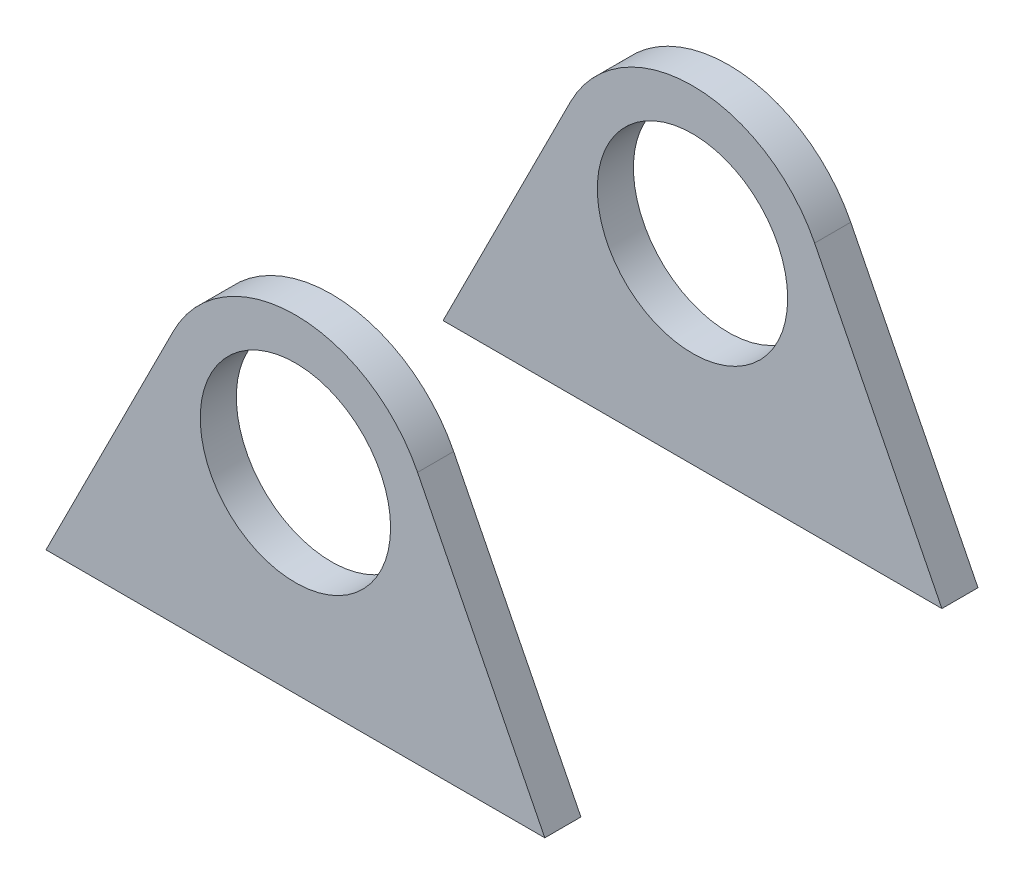
ISO-10303-21;
HEADER;
FILE_DESCRIPTION(('STEP AP214'),'2;1');
FILE_NAME('part.step','',(''),(''),'','','');
FILE_SCHEMA(('AUTOMOTIVE_DESIGN { 1 0 10303 214 1 1 1 1 }'));
ENDSEC;
DATA;
#1=APPLICATION_CONTEXT('core data for automotive mechanical design processes');
#2=APPLICATION_PROTOCOL_DEFINITION('international standard','automotive_design',2000,#1);
#3=PRODUCT_CONTEXT('',#1,'mechanical');
#4=PRODUCT('Part','Part','',(#3));
#5=PRODUCT_RELATED_PRODUCT_CATEGORY('part','',(#4));
#6=PRODUCT_DEFINITION_FORMATION('','',#4);
#7=PRODUCT_DEFINITION_CONTEXT('part definition',#1,'design');
#8=PRODUCT_DEFINITION('design','',#6,#7);
#9=PRODUCT_DEFINITION_SHAPE('','',#8);
#10=(LENGTH_UNIT() NAMED_UNIT(*) SI_UNIT(.MILLI.,.METRE.));
#11=(NAMED_UNIT(*) PLANE_ANGLE_UNIT() SI_UNIT($,.RADIAN.));
#12=(NAMED_UNIT(*) SI_UNIT($,.STERADIAN.) SOLID_ANGLE_UNIT());
#13=UNCERTAINTY_MEASURE_WITH_UNIT(LENGTH_MEASURE(1.E-05),#10,'distance_accuracy_value','');
#14=(GEOMETRIC_REPRESENTATION_CONTEXT(3) GLOBAL_UNCERTAINTY_ASSIGNED_CONTEXT((#13)) GLOBAL_UNIT_ASSIGNED_CONTEXT((#10,
#11,#12)) REPRESENTATION_CONTEXT('',''));
#15=CARTESIAN_POINT('',(0.,0.,0.));
#16=DIRECTION('',(0.,0.,1.));
#17=DIRECTION('',(1.,0.,0.));
#18=AXIS2_PLACEMENT_3D('',#15,#16,#17);
#19=CARTESIAN_POINT('',(0.,0.,36.3));
#20=DIRECTION('',(0.,0.,1.));
#21=DIRECTION('',(-1.,0.,0.));
#22=AXIS2_PLACEMENT_3D('',#19,#20,#21);
#23=PLANE('',#22);
#24=DIRECTION('',(-0.449518691350352,0.893270925378559,0.));
#25=VECTOR('',#24,1.);
#26=CARTESIAN_POINT('',(22.8,-17.5,36.3));
#27=LINE('',#26,#25);
#28=CARTESIAN_POINT('',(22.8,-17.5,36.3));
#29=VERTEX_POINT('',#28);
#30=CARTESIAN_POINT('',(11.165886567232,5.6189836418794,36.3));
#31=VERTEX_POINT('',#30);
#32=EDGE_CURVE('E99',#29,#31,#27,.T.);
#33=ORIENTED_EDGE('',*,*,#32,.F.);
#34=DIRECTION('',(1.,0.,0.));
#35=VECTOR('',#34,1.);
#36=CARTESIAN_POINT('',(-22.8,-17.5,36.3));
#37=LINE('',#36,#35);
#38=CARTESIAN_POINT('',(-22.8,-17.5,36.3));
#39=VERTEX_POINT('',#38);
#40=EDGE_CURVE('E102',#39,#29,#37,.T.);
#41=ORIENTED_EDGE('',*,*,#40,.F.);
#42=DIRECTION('',(-0.449518691350352,-0.893270925378559,0.));
#43=VECTOR('',#42,1.);
#44=CARTESIAN_POINT('',(-22.8,-17.5,36.3));
#45=LINE('',#44,#43);
#46=CARTESIAN_POINT('',(-11.165886567232,5.61898364187939,36.3));
#47=VERTEX_POINT('',#46);
#48=EDGE_CURVE('E90',#47,#39,#45,.T.);
#49=ORIENTED_EDGE('',*,*,#48,.F.);
#50=CARTESIAN_POINT('',(0.,0.,36.3));
#51=DIRECTION('',(0.,0.,1.));
#52=DIRECTION('',(-1.,0.,0.));
#53=AXIS2_PLACEMENT_3D('',#50,#51,#52);
#54=CIRCLE('',#53,12.5);
#55=EDGE_CURVE('E95',#31,#47,#54,.T.);
#56=ORIENTED_EDGE('',*,*,#55,.F.);
#57=EDGE_LOOP('',(#33,#41,#49,#56));
#58=FACE_BOUND('',#57,.T.);
#59=CARTESIAN_POINT('',(0.,0.,36.3));
#60=DIRECTION('',(0.,0.,1.));
#61=DIRECTION('',(1.,0.,0.));
#62=AXIS2_PLACEMENT_3D('',#59,#60,#61);
#63=CIRCLE('',#62,8.7);
#64=CARTESIAN_POINT('',(8.7,0.,36.3));
#65=VERTEX_POINT('',#64);
#66=EDGE_CURVE('E111',#65,#65,#63,.T.);
#67=ORIENTED_EDGE('',*,*,#66,.T.);
#68=EDGE_LOOP('',(#67));
#69=FACE_BOUND('',#68,.T.);
#70=ADVANCED_FACE('F43',(#58,#69),#23,.F.);
#71=CARTESIAN_POINT('',(0.,0.,39.6));
#72=DIRECTION('',(0.,0.,1.));
#73=DIRECTION('',(-1.,0.,0.));
#74=AXIS2_PLACEMENT_3D('',#71,#72,#73);
#75=PLANE('',#74);
#76=DIRECTION('',(-0.449518691350352,0.893270925378559,0.));
#77=VECTOR('',#76,1.);
#78=CARTESIAN_POINT('',(22.8,-17.5,39.6));
#79=LINE('',#78,#77);
#80=CARTESIAN_POINT('',(22.8,-17.5,39.6));
#81=VERTEX_POINT('',#80);
#82=CARTESIAN_POINT('',(11.165886567232,5.6189836418794,39.6));
#83=VERTEX_POINT('',#82);
#84=EDGE_CURVE('E107',#81,#83,#79,.T.);
#85=ORIENTED_EDGE('',*,*,#84,.T.);
#86=CARTESIAN_POINT('',(0.,0.,39.6));
#87=DIRECTION('',(0.,0.,1.));
#88=DIRECTION('',(-1.,0.,0.));
#89=AXIS2_PLACEMENT_3D('',#86,#87,#88);
#90=CIRCLE('',#89,12.5);
#91=CARTESIAN_POINT('',(-11.165886567232,5.61898364187939,39.6));
#92=VERTEX_POINT('',#91);
#93=EDGE_CURVE('E110',#83,#92,#90,.T.);
#94=ORIENTED_EDGE('',*,*,#93,.T.);
#95=DIRECTION('',(-0.449518691350352,-0.893270925378559,0.));
#96=VECTOR('',#95,1.);
#97=CARTESIAN_POINT('',(-22.8,-17.5,39.6));
#98=LINE('',#97,#96);
#99=CARTESIAN_POINT('',(-22.8,-17.5,39.6));
#100=VERTEX_POINT('',#99);
#101=EDGE_CURVE('E93',#92,#100,#98,.T.);
#102=ORIENTED_EDGE('',*,*,#101,.T.);
#103=DIRECTION('',(1.,0.,0.));
#104=VECTOR('',#103,1.);
#105=CARTESIAN_POINT('',(-22.8,-17.5,39.6));
#106=LINE('',#105,#104);
#107=EDGE_CURVE('E114',#100,#81,#106,.T.);
#108=ORIENTED_EDGE('',*,*,#107,.T.);
#109=EDGE_LOOP('',(#85,#94,#102,#108));
#110=FACE_BOUND('',#109,.T.);
#111=CARTESIAN_POINT('',(0.,0.,39.6));
#112=DIRECTION('',(0.,0.,1.));
#113=DIRECTION('',(1.,0.,0.));
#114=AXIS2_PLACEMENT_3D('',#111,#112,#113);
#115=CIRCLE('',#114,8.7);
#116=CARTESIAN_POINT('',(8.7,0.,39.6));
#117=VERTEX_POINT('',#116);
#118=EDGE_CURVE('E119',#117,#117,#115,.T.);
#119=ORIENTED_EDGE('',*,*,#118,.F.);
#120=EDGE_LOOP('',(#119));
#121=FACE_BOUND('',#120,.T.);
#122=ADVANCED_FACE('F132',(#110,#121),#75,.T.);
#123=CARTESIAN_POINT('',(22.8,-17.5,36.3));
#124=DIRECTION('',(-0.893270925378559,-0.449518691350352,0.));
#125=DIRECTION('',(0.449518691350352,-0.893270925378559,0.));
#126=AXIS2_PLACEMENT_3D('',#123,#124,#125);
#127=PLANE('',#126);
#128=ORIENTED_EDGE('',*,*,#84,.F.);
#129=DIRECTION('',(0.,0.,1.));
#130=VECTOR('',#129,1.);
#131=CARTESIAN_POINT('',(22.8,-17.5,36.3));
#132=LINE('',#131,#130);
#133=EDGE_CURVE('E60',#29,#81,#132,.T.);
#134=ORIENTED_EDGE('',*,*,#133,.F.);
#135=ORIENTED_EDGE('',*,*,#32,.T.);
#136=DIRECTION('',(0.,0.,1.));
#137=VECTOR('',#136,1.);
#138=CARTESIAN_POINT('',(11.165886567232,5.6189836418794,36.3));
#139=LINE('',#138,#137);
#140=EDGE_CURVE('E12',#31,#83,#139,.T.);
#141=ORIENTED_EDGE('',*,*,#140,.T.);
#142=EDGE_LOOP('',(#128,#134,#135,#141));
#143=FACE_BOUND('',#142,.T.);
#144=ADVANCED_FACE('F45',(#143),#127,.F.);
#145=CARTESIAN_POINT('',(0.,0.,36.3));
#146=DIRECTION('',(0.,0.,1.));
#147=DIRECTION('',(-1.,0.,0.));
#148=AXIS2_PLACEMENT_3D('',#145,#146,#147);
#149=CYLINDRICAL_SURFACE('',#148,12.5);
#150=ORIENTED_EDGE('',*,*,#93,.F.);
#151=ORIENTED_EDGE('',*,*,#140,.F.);
#152=ORIENTED_EDGE('',*,*,#55,.T.);
#153=DIRECTION('',(0.,0.,1.));
#154=VECTOR('',#153,1.);
#155=CARTESIAN_POINT('',(-11.165886567232,5.61898364187939,36.3));
#156=LINE('',#155,#154);
#157=EDGE_CURVE('E52',#47,#92,#156,.T.);
#158=ORIENTED_EDGE('',*,*,#157,.T.);
#159=EDGE_LOOP('',(#150,#151,#152,#158));
#160=FACE_BOUND('',#159,.T.);
#161=ADVANCED_FACE('F96',(#160),#149,.T.);
#162=CARTESIAN_POINT('',(-22.8,-17.5,36.3));
#163=DIRECTION('',(0.893270925378559,-0.449518691350352,0.));
#164=DIRECTION('',(0.449518691350352,0.893270925378559,0.));
#165=AXIS2_PLACEMENT_3D('',#162,#163,#164);
#166=PLANE('',#165);
#167=ORIENTED_EDGE('',*,*,#101,.F.);
#168=ORIENTED_EDGE('',*,*,#157,.F.);
#169=ORIENTED_EDGE('',*,*,#48,.T.);
#170=DIRECTION('',(0.,0.,1.));
#171=VECTOR('',#170,1.);
#172=CARTESIAN_POINT('',(-22.8,-17.5,36.3));
#173=LINE('',#172,#171);
#174=EDGE_CURVE('E76',#39,#100,#173,.T.);
#175=ORIENTED_EDGE('',*,*,#174,.T.);
#176=EDGE_LOOP('',(#167,#168,#169,#175));
#177=FACE_BOUND('',#176,.T.);
#178=ADVANCED_FACE('F88',(#177),#166,.F.);
#179=CARTESIAN_POINT('',(-22.8,-17.5,36.3));
#180=DIRECTION('',(0.,1.,0.));
#181=DIRECTION('',(0.,0.,-1.));
#182=AXIS2_PLACEMENT_3D('',#179,#180,#181);
#183=PLANE('',#182);
#184=ORIENTED_EDGE('',*,*,#107,.F.);
#185=ORIENTED_EDGE('',*,*,#174,.F.);
#186=ORIENTED_EDGE('',*,*,#40,.T.);
#187=ORIENTED_EDGE('',*,*,#133,.T.);
#188=EDGE_LOOP('',(#184,#185,#186,#187));
#189=FACE_BOUND('',#188,.T.);
#190=ADVANCED_FACE('F128',(#189),#183,.F.);
#191=CARTESIAN_POINT('',(0.,0.,36.3));
#192=DIRECTION('',(0.,0.,1.));
#193=DIRECTION('',(-1.,0.,0.));
#194=AXIS2_PLACEMENT_3D('',#191,#192,#193);
#195=CYLINDRICAL_SURFACE('',#194,8.7);
#196=ORIENTED_EDGE('',*,*,#66,.F.);
#197=EDGE_LOOP('',(#196));
#198=FACE_BOUND('',#197,.T.);
#199=ORIENTED_EDGE('',*,*,#118,.T.);
#200=EDGE_LOOP('',(#199));
#201=FACE_BOUND('',#200,.T.);
#202=ADVANCED_FACE('F125',(#198,#201),#195,.F.);
#203=CLOSED_SHELL('',(#70,#122,#144,#161,#178,#190,#202));
#204=MANIFOLD_SOLID_BREP('B2',#203);
#205=CARTESIAN_POINT('',(0.,0.,3.3));
#206=DIRECTION('',(0.,0.,-1.));
#207=DIRECTION('',(-1.,0.,0.));
#208=AXIS2_PLACEMENT_3D('',#205,#206,#207);
#209=PLANE('',#208);
#210=DIRECTION('',(-0.449518691350352,0.893270925378559,0.));
#211=VECTOR('',#210,1.);
#212=CARTESIAN_POINT('',(22.8,-17.5,3.3));
#213=LINE('',#212,#211);
#214=CARTESIAN_POINT('',(22.8,-17.5,3.3));
#215=VERTEX_POINT('',#214);
#216=CARTESIAN_POINT('',(11.165886567232,5.6189836418794,3.3));
#217=VERTEX_POINT('',#216);
#218=EDGE_CURVE('E240',#215,#217,#213,.T.);
#219=ORIENTED_EDGE('',*,*,#218,.T.);
#220=CARTESIAN_POINT('',(0.,0.,3.3));
#221=DIRECTION('',(0.,0.,1.));
#222=DIRECTION('',(-1.,0.,0.));
#223=AXIS2_PLACEMENT_3D('',#220,#221,#222);
#224=CIRCLE('',#223,12.5);
#225=CARTESIAN_POINT('',(-11.165886567232,5.61898364187939,3.3));
#226=VERTEX_POINT('',#225);
#227=EDGE_CURVE('E235',#217,#226,#224,.T.);
#228=ORIENTED_EDGE('',*,*,#227,.T.);
#229=DIRECTION('',(-0.449518691350352,-0.893270925378559,0.));
#230=VECTOR('',#229,1.);
#231=CARTESIAN_POINT('',(-22.8,-17.5,3.3));
#232=LINE('',#231,#230);
#233=CARTESIAN_POINT('',(-22.8,-17.5,3.3));
#234=VERTEX_POINT('',#233);
#235=EDGE_CURVE('E238',#226,#234,#232,.T.);
#236=ORIENTED_EDGE('',*,*,#235,.T.);
#237=DIRECTION('',(1.,0.,0.));
#238=VECTOR('',#237,1.);
#239=CARTESIAN_POINT('',(-22.8,-17.5,3.3));
#240=LINE('',#239,#238);
#241=EDGE_CURVE('E205',#234,#215,#240,.T.);
#242=ORIENTED_EDGE('',*,*,#241,.T.);
#243=EDGE_LOOP('',(#219,#228,#236,#242));
#244=FACE_BOUND('',#243,.T.);
#245=CARTESIAN_POINT('',(0.,0.,3.3));
#246=DIRECTION('',(0.,0.,1.));
#247=DIRECTION('',(1.,0.,0.));
#248=AXIS2_PLACEMENT_3D('',#245,#246,#247);
#249=CIRCLE('',#248,8.7);
#250=CARTESIAN_POINT('',(8.7,0.,3.3));
#251=VERTEX_POINT('',#250);
#252=EDGE_CURVE('E255',#251,#251,#249,.T.);
#253=ORIENTED_EDGE('',*,*,#252,.F.);
#254=EDGE_LOOP('',(#253));
#255=FACE_BOUND('',#254,.T.);
#256=ADVANCED_FACE('F188',(#244,#255),#209,.F.);
#257=CARTESIAN_POINT('',(0.,0.,0.));
#258=DIRECTION('',(0.,0.,-1.));
#259=DIRECTION('',(-1.,0.,0.));
#260=AXIS2_PLACEMENT_3D('',#257,#258,#259);
#261=PLANE('',#260);
#262=DIRECTION('',(-0.449518691350352,0.893270925378559,0.));
#263=VECTOR('',#262,1.);
#264=CARTESIAN_POINT('',(22.8,-17.5,0.));
#265=LINE('',#264,#263);
#266=CARTESIAN_POINT('',(22.8,-17.5,0.));
#267=VERTEX_POINT('',#266);
#268=CARTESIAN_POINT('',(11.165886567232,5.6189836418794,0.));
#269=VERTEX_POINT('',#268);
#270=EDGE_CURVE('E252',#267,#269,#265,.T.);
#271=ORIENTED_EDGE('',*,*,#270,.F.);
#272=DIRECTION('',(1.,0.,0.));
#273=VECTOR('',#272,1.);
#274=CARTESIAN_POINT('',(-22.8,-17.5,0.));
#275=LINE('',#274,#273);
#276=CARTESIAN_POINT('',(-22.8,-17.5,0.));
#277=VERTEX_POINT('',#276);
#278=EDGE_CURVE('E228',#277,#267,#275,.T.);
#279=ORIENTED_EDGE('',*,*,#278,.F.);
#280=DIRECTION('',(-0.449518691350352,-0.893270925378559,0.));
#281=VECTOR('',#280,1.);
#282=CARTESIAN_POINT('',(-22.8,-17.5,0.));
#283=LINE('',#282,#281);
#284=CARTESIAN_POINT('',(-11.165886567232,5.61898364187939,0.));
#285=VERTEX_POINT('',#284);
#286=EDGE_CURVE('E222',#285,#277,#283,.T.);
#287=ORIENTED_EDGE('',*,*,#286,.F.);
#288=CARTESIAN_POINT('',(0.,0.,0.));
#289=DIRECTION('',(0.,0.,1.));
#290=DIRECTION('',(-1.,0.,0.));
#291=AXIS2_PLACEMENT_3D('',#288,#289,#290);
#292=CIRCLE('',#291,12.5);
#293=EDGE_CURVE('E244',#269,#285,#292,.T.);
#294=ORIENTED_EDGE('',*,*,#293,.F.);
#295=EDGE_LOOP('',(#271,#279,#287,#294));
#296=FACE_BOUND('',#295,.T.);
#297=CARTESIAN_POINT('',(0.,0.,0.));
#298=DIRECTION('',(0.,0.,1.));
#299=DIRECTION('',(1.,0.,0.));
#300=AXIS2_PLACEMENT_3D('',#297,#298,#299);
#301=CIRCLE('',#300,8.7);
#302=CARTESIAN_POINT('',(8.7,0.,0.));
#303=VERTEX_POINT('',#302);
#304=EDGE_CURVE('E267',#303,#303,#301,.T.);
#305=ORIENTED_EDGE('',*,*,#304,.T.);
#306=EDGE_LOOP('',(#305));
#307=FACE_BOUND('',#306,.T.);
#308=ADVANCED_FACE('F263',(#296,#307),#261,.T.);
#309=CARTESIAN_POINT('',(22.8,-17.5,3.3));
#310=DIRECTION('',(-0.893270925378559,-0.449518691350352,0.));
#311=DIRECTION('',(0.449518691350352,-0.893270925378559,0.));
#312=AXIS2_PLACEMENT_3D('',#309,#310,#311);
#313=PLANE('',#312);
#314=ORIENTED_EDGE('',*,*,#270,.T.);
#315=DIRECTION('',(0.,0.,-1.));
#316=VECTOR('',#315,1.);
#317=CARTESIAN_POINT('',(11.165886567232,5.6189836418794,3.3));
#318=LINE('',#317,#316);
#319=EDGE_CURVE('E41',#217,#269,#318,.T.);
#320=ORIENTED_EDGE('',*,*,#319,.F.);
#321=ORIENTED_EDGE('',*,*,#218,.F.);
#322=DIRECTION('',(0.,0.,-1.));
#323=VECTOR('',#322,1.);
#324=CARTESIAN_POINT('',(22.8,-17.5,3.3));
#325=LINE('',#324,#323);
#326=EDGE_CURVE('E248',#215,#267,#325,.T.);
#327=ORIENTED_EDGE('',*,*,#326,.T.);
#328=EDGE_LOOP('',(#314,#320,#321,#327));
#329=FACE_BOUND('',#328,.T.);
#330=ADVANCED_FACE('F190',(#329),#313,.F.);
#331=CARTESIAN_POINT('',(0.,0.,3.3));
#332=DIRECTION('',(0.,0.,-1.));
#333=DIRECTION('',(-1.,0.,0.));
#334=AXIS2_PLACEMENT_3D('',#331,#332,#333);
#335=CYLINDRICAL_SURFACE('',#334,12.5);
#336=ORIENTED_EDGE('',*,*,#293,.T.);
#337=DIRECTION('',(0.,0.,-1.));
#338=VECTOR('',#337,1.);
#339=CARTESIAN_POINT('',(-11.165886567232,5.61898364187939,3.3));
#340=LINE('',#339,#338);
#341=EDGE_CURVE('E197',#226,#285,#340,.T.);
#342=ORIENTED_EDGE('',*,*,#341,.F.);
#343=ORIENTED_EDGE('',*,*,#227,.F.);
#344=ORIENTED_EDGE('',*,*,#319,.T.);
#345=EDGE_LOOP('',(#336,#342,#343,#344));
#346=FACE_BOUND('',#345,.T.);
#347=ADVANCED_FACE('F243',(#346),#335,.T.);
#348=CARTESIAN_POINT('',(-22.8,-17.5,3.3));
#349=DIRECTION('',(0.893270925378559,-0.449518691350352,0.));
#350=DIRECTION('',(0.449518691350352,0.893270925378559,0.));
#351=AXIS2_PLACEMENT_3D('',#348,#349,#350);
#352=PLANE('',#351);
#353=ORIENTED_EDGE('',*,*,#286,.T.);
#354=DIRECTION('',(0.,0.,-1.));
#355=VECTOR('',#354,1.);
#356=CARTESIAN_POINT('',(-22.8,-17.5,3.3));
#357=LINE('',#356,#355);
#358=EDGE_CURVE('E245',#234,#277,#357,.T.);
#359=ORIENTED_EDGE('',*,*,#358,.F.);
#360=ORIENTED_EDGE('',*,*,#235,.F.);
#361=ORIENTED_EDGE('',*,*,#341,.T.);
#362=EDGE_LOOP('',(#353,#359,#360,#361));
#363=FACE_BOUND('',#362,.T.);
#364=ADVANCED_FACE('F246',(#363),#352,.F.);
#365=CARTESIAN_POINT('',(-22.8,-17.5,3.3));
#366=DIRECTION('',(0.,1.,0.));
#367=DIRECTION('',(0.,0.,1.));
#368=AXIS2_PLACEMENT_3D('',#365,#366,#367);
#369=PLANE('',#368);
#370=ORIENTED_EDGE('',*,*,#278,.T.);
#371=ORIENTED_EDGE('',*,*,#326,.F.);
#372=ORIENTED_EDGE('',*,*,#241,.F.);
#373=ORIENTED_EDGE('',*,*,#358,.T.);
#374=EDGE_LOOP('',(#370,#371,#372,#373));
#375=FACE_BOUND('',#374,.T.);
#376=ADVANCED_FACE('F260',(#375),#369,.F.);
#377=CARTESIAN_POINT('',(0.,0.,3.3));
#378=DIRECTION('',(0.,0.,-1.));
#379=DIRECTION('',(-1.,0.,0.));
#380=AXIS2_PLACEMENT_3D('',#377,#378,#379);
#381=CYLINDRICAL_SURFACE('',#380,8.7);
#382=ORIENTED_EDGE('',*,*,#252,.T.);
#383=EDGE_LOOP('',(#382));
#384=FACE_BOUND('',#383,.T.);
#385=ORIENTED_EDGE('',*,*,#304,.F.);
#386=EDGE_LOOP('',(#385));
#387=FACE_BOUND('',#386,.T.);
#388=ADVANCED_FACE('F273',(#384,#387),#381,.F.);
#389=CLOSED_SHELL('',(#256,#308,#330,#347,#364,#376,#388));
#390=MANIFOLD_SOLID_BREP('B6',#389);
#391=ADVANCED_BREP_SHAPE_REPRESENTATION('',(#18,#204,#390),#14);
#392=SHAPE_DEFINITION_REPRESENTATION(#9,#391);
ENDSEC;
END-ISO-10303-21;
